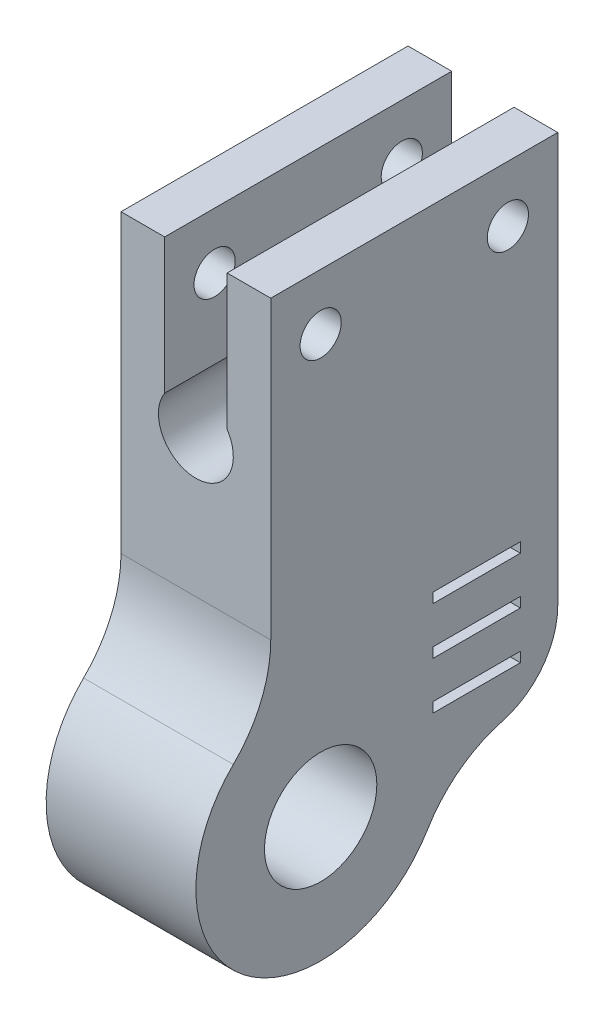
ISO-10303-21;
HEADER;
FILE_DESCRIPTION(('STEP AP214'),'2;1');
FILE_NAME('part.step','',(''),(''),'','','');
FILE_SCHEMA(('AUTOMOTIVE_DESIGN { 1 0 10303 214 1 1 1 1 }'));
ENDSEC;
DATA;
#1=APPLICATION_CONTEXT('core data for automotive mechanical design processes');
#2=APPLICATION_PROTOCOL_DEFINITION('international standard','automotive_design',2000,#1);
#3=PRODUCT_CONTEXT('',#1,'mechanical');
#4=PRODUCT('Part','Part','',(#3));
#5=PRODUCT_RELATED_PRODUCT_CATEGORY('part','',(#4));
#6=PRODUCT_DEFINITION_FORMATION('','',#4);
#7=PRODUCT_DEFINITION_CONTEXT('part definition',#1,'design');
#8=PRODUCT_DEFINITION('design','',#6,#7);
#9=PRODUCT_DEFINITION_SHAPE('','',#8);
#10=(LENGTH_UNIT() NAMED_UNIT(*) SI_UNIT(.MILLI.,.METRE.));
#11=(NAMED_UNIT(*) PLANE_ANGLE_UNIT() SI_UNIT($,.RADIAN.));
#12=(NAMED_UNIT(*) SI_UNIT($,.STERADIAN.) SOLID_ANGLE_UNIT());
#13=UNCERTAINTY_MEASURE_WITH_UNIT(LENGTH_MEASURE(1.E-05),#10,'distance_accuracy_value','');
#14=(GEOMETRIC_REPRESENTATION_CONTEXT(3) GLOBAL_UNCERTAINTY_ASSIGNED_CONTEXT((#13)) GLOBAL_UNIT_ASSIGNED_CONTEXT((#10,
#11,#12)) REPRESENTATION_CONTEXT('',''));
#15=CARTESIAN_POINT('',(0.,0.,0.));
#16=DIRECTION('',(0.,0.,1.));
#17=DIRECTION('',(1.,0.,0.));
#18=AXIS2_PLACEMENT_3D('',#15,#16,#17);
#19=CARTESIAN_POINT('',(0.,0.299999999999998,-4.));
#20=DIRECTION('',(-1.,0.,0.));
#21=DIRECTION('',(0.,0.,1.));
#22=AXIS2_PLACEMENT_3D('',#19,#20,#21);
#23=PLANE('',#22);
#24=CARTESIAN_POINT('',(0.,33.8,-4.));
#25=DIRECTION('',(1.,0.,0.));
#26=DIRECTION('',(0.,0.,-1.));
#27=AXIS2_PLACEMENT_3D('',#24,#25,#26);
#28=CIRCLE('',#27,1.65);
#29=CARTESIAN_POINT('',(0.,33.8,-5.65));
#30=VERTEX_POINT('',#29);
#31=EDGE_CURVE('E297',#30,#30,#28,.T.);
#32=ORIENTED_EDGE('',*,*,#31,.T.);
#33=EDGE_LOOP('',(#32));
#34=FACE_BOUND('',#33,.T.);
#35=DIRECTION('',(0.,0.,1.));
#36=VECTOR('',#35,1.);
#37=CARTESIAN_POINT('',(0.,7.6,-13.));
#38=LINE('',#37,#36);
#39=CARTESIAN_POINT('',(0.,7.6,-20.));
#40=VERTEX_POINT('',#39);
#41=CARTESIAN_POINT('',(0.,7.6,-13.));
#42=VERTEX_POINT('',#41);
#43=EDGE_CURVE('E340',#40,#42,#38,.T.);
#44=ORIENTED_EDGE('',*,*,#43,.T.);
#45=DIRECTION('',(0.,-1.,0.));
#46=VECTOR('',#45,1.);
#47=CARTESIAN_POINT('',(0.,7.6,-13.));
#48=LINE('',#47,#46);
#49=CARTESIAN_POINT('',(0.,6.8,-13.));
#50=VERTEX_POINT('',#49);
#51=EDGE_CURVE('E336',#42,#50,#48,.T.);
#52=ORIENTED_EDGE('',*,*,#51,.T.);
#53=DIRECTION('',(0.,0.,-1.));
#54=VECTOR('',#53,1.);
#55=CARTESIAN_POINT('',(0.,6.8,-13.));
#56=LINE('',#55,#54);
#57=CARTESIAN_POINT('',(0.,6.8,-20.));
#58=VERTEX_POINT('',#57);
#59=EDGE_CURVE('E350',#50,#58,#56,.T.);
#60=ORIENTED_EDGE('',*,*,#59,.T.);
#61=DIRECTION('',(0.,1.,0.));
#62=VECTOR('',#61,1.);
#63=CARTESIAN_POINT('',(0.,7.6,-20.));
#64=LINE('',#63,#62);
#65=EDGE_CURVE('E353',#58,#40,#64,.T.);
#66=ORIENTED_EDGE('',*,*,#65,.T.);
#67=EDGE_LOOP('',(#44,#52,#60,#66));
#68=FACE_BOUND('',#67,.T.);
#69=DIRECTION('',(0.,1.,0.));
#70=VECTOR('',#69,1.);
#71=CARTESIAN_POINT('',(0.,0.,-23.));
#72=LINE('',#71,#70);
#73=CARTESIAN_POINT('',(0.,5.45408982043008,-23.));
#74=VERTEX_POINT('',#73);
#75=CARTESIAN_POINT('',(0.,38.3,-23.));
#76=VERTEX_POINT('',#75);
#77=EDGE_CURVE('E398',#74,#76,#72,.T.);
#78=ORIENTED_EDGE('',*,*,#77,.F.);
#79=CARTESIAN_POINT('',(0.,5.45408982043008,-17.));
#80=DIRECTION('',(-1.,0.,0.));
#81=DIRECTION('',(0.,0.,1.));
#82=AXIS2_PLACEMENT_3D('',#79,#80,#81);
#83=CIRCLE('',#82,6.);
#84=CARTESIAN_POINT('',(0.,-0.341193862231198,-18.5539263294892));
#85=VERTEX_POINT('',#84);
#86=EDGE_CURVE('E55',#74,#85,#83,.T.);
#87=ORIENTED_EDGE('',*,*,#86,.T.);
#88=CARTESIAN_POINT('',(0.,-10.,-21.1438035453046));
#89=DIRECTION('',(-1.,0.,0.));
#90=DIRECTION('',(0.,0.,1.));
#91=AXIS2_PLACEMENT_3D('',#88,#89,#90);
#92=CIRCLE('',#91,10.);
#93=CARTESIAN_POINT('',(0.,-4.85,-12.5719017726523));
#94=VERTEX_POINT('',#93);
#95=EDGE_CURVE('E438',#85,#94,#92,.F.);
#96=ORIENTED_EDGE('',*,*,#95,.T.);
#97=CARTESIAN_POINT('',(0.,0.299999999999998,-4.));
#98=DIRECTION('',(1.,0.,0.));
#99=DIRECTION('',(0.,0.,1.));
#100=AXIS2_PLACEMENT_3D('',#97,#98,#99);
#101=CIRCLE('',#100,10.);
#102=CARTESIAN_POINT('',(0.,7.44142842854285,3.));
#103=VERTEX_POINT('',#102);
#104=EDGE_CURVE('E402',#103,#94,#101,.T.);
#105=ORIENTED_EDGE('',*,*,#104,.F.);
#106=CARTESIAN_POINT('',(0.,14.5828568570857,10.));
#107=DIRECTION('',(-1.,0.,0.));
#108=DIRECTION('',(0.,0.,1.));
#109=AXIS2_PLACEMENT_3D('',#106,#107,#108);
#110=CIRCLE('',#109,10.);
#111=CARTESIAN_POINT('',(0.,14.5828568570857,0.));
#112=VERTEX_POINT('',#111);
#113=EDGE_CURVE('E442',#103,#112,#110,.F.);
#114=ORIENTED_EDGE('',*,*,#113,.T.);
#115=DIRECTION('',(0.,-1.,0.));
#116=VECTOR('',#115,1.);
#117=CARTESIAN_POINT('',(0.,9.46515138991168,0.));
#118=LINE('',#117,#116);
#119=CARTESIAN_POINT('',(0.,38.3,0.));
#120=VERTEX_POINT('',#119);
#121=EDGE_CURVE('E415',#120,#112,#118,.T.);
#122=ORIENTED_EDGE('',*,*,#121,.F.);
#123=DIRECTION('',(0.,0.,1.));
#124=VECTOR('',#123,1.);
#125=CARTESIAN_POINT('',(0.,38.3,0.));
#126=LINE('',#125,#124);
#127=EDGE_CURVE('E412',#76,#120,#126,.T.);
#128=ORIENTED_EDGE('',*,*,#127,.F.);
#129=EDGE_LOOP('',(#78,#87,#96,#105,#114,#122,#128));
#130=FACE_BOUND('',#129,.T.);
#131=DIRECTION('',(0.,0.,1.));
#132=VECTOR('',#131,1.);
#133=CARTESIAN_POINT('',(0.,3.8,-13.));
#134=LINE('',#133,#132);
#135=CARTESIAN_POINT('',(0.,3.8,-20.));
#136=VERTEX_POINT('',#135);
#137=CARTESIAN_POINT('',(0.,3.8,-13.));
#138=VERTEX_POINT('',#137);
#139=EDGE_CURVE('E371',#136,#138,#134,.T.);
#140=ORIENTED_EDGE('',*,*,#139,.T.);
#141=DIRECTION('',(0.,-1.,0.));
#142=VECTOR('',#141,1.);
#143=CARTESIAN_POINT('',(0.,3.8,-13.));
#144=LINE('',#143,#142);
#145=CARTESIAN_POINT('',(0.,3.,-13.));
#146=VERTEX_POINT('',#145);
#147=EDGE_CURVE('E367',#138,#146,#144,.T.);
#148=ORIENTED_EDGE('',*,*,#147,.T.);
#149=DIRECTION('',(0.,0.,-1.));
#150=VECTOR('',#149,1.);
#151=CARTESIAN_POINT('',(0.,3.,-13.));
#152=LINE('',#151,#150);
#153=CARTESIAN_POINT('',(0.,3.,-20.));
#154=VERTEX_POINT('',#153);
#155=EDGE_CURVE('E381',#146,#154,#152,.T.);
#156=ORIENTED_EDGE('',*,*,#155,.T.);
#157=DIRECTION('',(0.,1.,0.));
#158=VECTOR('',#157,1.);
#159=CARTESIAN_POINT('',(0.,3.8,-20.));
#160=LINE('',#159,#158);
#161=EDGE_CURVE('E384',#154,#136,#160,.T.);
#162=ORIENTED_EDGE('',*,*,#161,.T.);
#163=EDGE_LOOP('',(#140,#148,#156,#162));
#164=FACE_BOUND('',#163,.T.);
#165=DIRECTION('',(0.,0.,1.));
#166=VECTOR('',#165,1.);
#167=CARTESIAN_POINT('',(0.,11.4,-13.));
#168=LINE('',#167,#166);
#169=CARTESIAN_POINT('',(0.,11.4,-20.));
#170=VERTEX_POINT('',#169);
#171=CARTESIAN_POINT('',(0.,11.4,-13.));
#172=VERTEX_POINT('',#171);
#173=EDGE_CURVE('E309',#170,#172,#168,.T.);
#174=ORIENTED_EDGE('',*,*,#173,.T.);
#175=DIRECTION('',(0.,-1.,0.));
#176=VECTOR('',#175,1.);
#177=CARTESIAN_POINT('',(0.,10.6,-13.));
#178=LINE('',#177,#176);
#179=CARTESIAN_POINT('',(0.,10.6,-13.));
#180=VERTEX_POINT('',#179);
#181=EDGE_CURVE('E303',#172,#180,#178,.T.);
#182=ORIENTED_EDGE('',*,*,#181,.T.);
#183=DIRECTION('',(0.,0.,-1.));
#184=VECTOR('',#183,1.);
#185=CARTESIAN_POINT('',(0.,10.6,-13.));
#186=LINE('',#185,#184);
#187=CARTESIAN_POINT('',(0.,10.6,-20.));
#188=VERTEX_POINT('',#187);
#189=EDGE_CURVE('E319',#180,#188,#186,.T.);
#190=ORIENTED_EDGE('',*,*,#189,.T.);
#191=DIRECTION('',(0.,1.,0.));
#192=VECTOR('',#191,1.);
#193=CARTESIAN_POINT('',(0.,10.6,-20.));
#194=LINE('',#193,#192);
#195=EDGE_CURVE('E322',#188,#170,#194,.T.);
#196=ORIENTED_EDGE('',*,*,#195,.T.);
#197=EDGE_LOOP('',(#174,#182,#190,#196));
#198=FACE_BOUND('',#197,.T.);
#199=CARTESIAN_POINT('',(0.,33.8,-19.));
#200=DIRECTION('',(1.,0.,0.));
#201=DIRECTION('',(0.,0.,-1.));
#202=AXIS2_PLACEMENT_3D('',#199,#200,#201);
#203=CIRCLE('',#202,1.65);
#204=CARTESIAN_POINT('',(0.,33.8,-20.65));
#205=VERTEX_POINT('',#204);
#206=EDGE_CURVE('E293',#205,#205,#203,.T.);
#207=ORIENTED_EDGE('',*,*,#206,.T.);
#208=EDGE_LOOP('',(#207));
#209=FACE_BOUND('',#208,.T.);
#210=DIRECTION('',(0.,0.866025403784439,0.499999999999999));
#211=VECTOR('',#210,1.);
#212=CARTESIAN_POINT('',(0.,0.299999999999993,-11.7942286340599));
#213=LINE('',#212,#211);
#214=CARTESIAN_POINT('',(0.,0.299999999999993,-11.7942286340599));
#215=VERTEX_POINT('',#214);
#216=CARTESIAN_POINT('',(0.,7.04999999999999,-7.89711431702998));
#217=VERTEX_POINT('',#216);
#218=EDGE_CURVE('E242',#215,#217,#213,.T.);
#219=ORIENTED_EDGE('',*,*,#218,.T.);
#220=DIRECTION('',(0.,0.,1.));
#221=VECTOR('',#220,1.);
#222=CARTESIAN_POINT('',(0.,7.04999999999999,-7.89711431702998));
#223=LINE('',#222,#221);
#224=CARTESIAN_POINT('',(0.,7.04999999999999,-0.102885682970029));
#225=VERTEX_POINT('',#224);
#226=EDGE_CURVE('E652',#217,#225,#223,.T.);
#227=ORIENTED_EDGE('',*,*,#226,.T.);
#228=DIRECTION('',(0.,-0.866025403784439,0.5));
#229=VECTOR('',#228,1.);
#230=CARTESIAN_POINT('',(0.,7.04999999999999,-0.102885682970029));
#231=LINE('',#230,#229);
#232=CARTESIAN_POINT('',(0.,0.3,3.79422863405994));
#233=VERTEX_POINT('',#232);
#234=EDGE_CURVE('E246',#225,#233,#231,.T.);
#235=ORIENTED_EDGE('',*,*,#234,.T.);
#236=DIRECTION('',(0.,-0.866025403784439,-0.5));
#237=VECTOR('',#236,1.);
#238=CARTESIAN_POINT('',(0.,0.3,3.79422863405994));
#239=LINE('',#238,#237);
#240=CARTESIAN_POINT('',(0.,-6.45,-0.102885682970025));
#241=VERTEX_POINT('',#240);
#242=EDGE_CURVE('E671',#233,#241,#239,.T.);
#243=ORIENTED_EDGE('',*,*,#242,.T.);
#244=DIRECTION('',(0.,0.,-1.));
#245=VECTOR('',#244,1.);
#246=CARTESIAN_POINT('',(0.,-6.45,-0.102885682970025));
#247=LINE('',#246,#245);
#248=CARTESIAN_POINT('',(0.,-6.45,-7.89711431702997));
#249=VERTEX_POINT('',#248);
#250=EDGE_CURVE('E658',#241,#249,#247,.T.);
#251=ORIENTED_EDGE('',*,*,#250,.T.);
#252=DIRECTION('',(0.,0.866025403784438,-0.5));
#253=VECTOR('',#252,1.);
#254=CARTESIAN_POINT('',(0.,-6.45,-7.89711431702997));
#255=LINE('',#254,#253);
#256=EDGE_CURVE('E655',#249,#215,#255,.T.);
#257=ORIENTED_EDGE('',*,*,#256,.T.);
#258=EDGE_LOOP('',(#219,#227,#235,#243,#251,#257));
#259=FACE_BOUND('',#258,.T.);
#260=ADVANCED_FACE('F33',(#34,#68,#130,#164,#198,#209,#259),#23,.T.);
#261=CARTESIAN_POINT('',(12.,38.3,0.));
#262=DIRECTION('',(0.,-1.,0.));
#263=DIRECTION('',(0.,0.,-1.));
#264=AXIS2_PLACEMENT_3D('',#261,#262,#263);
#265=PLANE('',#264);
#266=DIRECTION('',(-1.,0.,0.));
#267=VECTOR('',#266,1.);
#268=CARTESIAN_POINT('',(12.,38.3,0.));
#269=LINE('',#268,#267);
#270=CARTESIAN_POINT('',(3.5,38.3,0.));
#271=VERTEX_POINT('',#270);
#272=EDGE_CURVE('E410',#271,#120,#269,.T.);
#273=ORIENTED_EDGE('',*,*,#272,.F.);
#274=DIRECTION('',(0.,0.,1.));
#275=VECTOR('',#274,1.);
#276=CARTESIAN_POINT('',(3.5,38.3,-23.));
#277=LINE('',#276,#275);
#278=CARTESIAN_POINT('',(3.5,38.3,-23.));
#279=VERTEX_POINT('',#278);
#280=EDGE_CURVE('E273',#279,#271,#277,.T.);
#281=ORIENTED_EDGE('',*,*,#280,.F.);
#282=DIRECTION('',(-1.,0.,0.));
#283=VECTOR('',#282,1.);
#284=CARTESIAN_POINT('',(12.,38.3,-23.));
#285=LINE('',#284,#283);
#286=EDGE_CURVE('E423',#279,#76,#285,.T.);
#287=ORIENTED_EDGE('',*,*,#286,.T.);
#288=ORIENTED_EDGE('',*,*,#127,.T.);
#289=EDGE_LOOP('',(#273,#281,#287,#288));
#290=FACE_BOUND('',#289,.T.);
#291=ADVANCED_FACE('F463',(#290),#265,.F.);
#292=CARTESIAN_POINT('',(12.,33.8,-4.));
#293=DIRECTION('',(-1.,0.,0.));
#294=DIRECTION('',(0.,0.,1.));
#295=AXIS2_PLACEMENT_3D('',#292,#293,#294);
#296=CYLINDRICAL_SURFACE('',#295,1.65);
#297=CARTESIAN_POINT('',(3.5,33.8,-4.));
#298=DIRECTION('',(-1.,0.,0.));
#299=DIRECTION('',(0.,-1.,0.));
#300=AXIS2_PLACEMENT_3D('',#297,#298,#299);
#301=CIRCLE('',#300,1.65);
#302=CARTESIAN_POINT('',(3.5,32.15,-4.));
#303=VERTEX_POINT('',#302);
#304=EDGE_CURVE('E287',#303,#303,#301,.T.);
#305=ORIENTED_EDGE('',*,*,#304,.F.);
#306=EDGE_LOOP('',(#305));
#307=FACE_BOUND('',#306,.T.);
#308=ORIENTED_EDGE('',*,*,#31,.F.);
#309=EDGE_LOOP('',(#308));
#310=FACE_BOUND('',#309,.T.);
#311=ADVANCED_FACE('F498',(#307,#310),#296,.F.);
#312=CARTESIAN_POINT('',(12.,33.8,-19.));
#313=DIRECTION('',(-1.,0.,0.));
#314=DIRECTION('',(0.,0.,1.));
#315=AXIS2_PLACEMENT_3D('',#312,#313,#314);
#316=CYLINDRICAL_SURFACE('',#315,1.65);
#317=CARTESIAN_POINT('',(3.5,33.8,-19.));
#318=DIRECTION('',(-1.,0.,0.));
#319=DIRECTION('',(0.,-1.,0.));
#320=AXIS2_PLACEMENT_3D('',#317,#318,#319);
#321=CIRCLE('',#320,1.65);
#322=CARTESIAN_POINT('',(3.5,32.15,-19.));
#323=VERTEX_POINT('',#322);
#324=EDGE_CURVE('E286',#323,#323,#321,.T.);
#325=ORIENTED_EDGE('',*,*,#324,.F.);
#326=EDGE_LOOP('',(#325));
#327=FACE_BOUND('',#326,.T.);
#328=ORIENTED_EDGE('',*,*,#206,.F.);
#329=EDGE_LOOP('',(#328));
#330=FACE_BOUND('',#329,.T.);
#331=ADVANCED_FACE('F567',(#327,#330),#316,.F.);
#332=CARTESIAN_POINT('',(12.,0.299999999999998,-4.));
#333=DIRECTION('',(-1.,0.,0.));
#334=DIRECTION('',(0.,0.,1.));
#335=AXIS2_PLACEMENT_3D('',#332,#333,#334);
#336=PLANE('',#335);
#337=CARTESIAN_POINT('',(12.,33.8,-19.));
#338=DIRECTION('',(1.,0.,0.));
#339=DIRECTION('',(0.,0.,-1.));
#340=AXIS2_PLACEMENT_3D('',#337,#338,#339);
#341=CIRCLE('',#340,1.65);
#342=CARTESIAN_POINT('',(12.,33.8,-20.65));
#343=VERTEX_POINT('',#342);
#344=EDGE_CURVE('E294',#343,#343,#341,.T.);
#345=ORIENTED_EDGE('',*,*,#344,.F.);
#346=EDGE_LOOP('',(#345));
#347=FACE_BOUND('',#346,.T.);
#348=DIRECTION('',(0.,-1.,0.));
#349=VECTOR('',#348,1.);
#350=CARTESIAN_POINT('',(12.,10.6,-13.));
#351=LINE('',#350,#349);
#352=CARTESIAN_POINT('',(12.,11.4,-13.));
#353=VERTEX_POINT('',#352);
#354=CARTESIAN_POINT('',(12.,10.6,-13.));
#355=VERTEX_POINT('',#354);
#356=EDGE_CURVE('E306',#353,#355,#351,.T.);
#357=ORIENTED_EDGE('',*,*,#356,.F.);
#358=DIRECTION('',(0.,0.,1.));
#359=VECTOR('',#358,1.);
#360=CARTESIAN_POINT('',(12.,11.4,-13.));
#361=LINE('',#360,#359);
#362=CARTESIAN_POINT('',(12.,11.4,-20.));
#363=VERTEX_POINT('',#362);
#364=EDGE_CURVE('E314',#363,#353,#361,.T.);
#365=ORIENTED_EDGE('',*,*,#364,.F.);
#366=DIRECTION('',(0.,1.,0.));
#367=VECTOR('',#366,1.);
#368=CARTESIAN_POINT('',(12.,10.6,-20.));
#369=LINE('',#368,#367);
#370=CARTESIAN_POINT('',(12.,10.6,-20.));
#371=VERTEX_POINT('',#370);
#372=EDGE_CURVE('E311',#371,#363,#369,.T.);
#373=ORIENTED_EDGE('',*,*,#372,.F.);
#374=DIRECTION('',(0.,0.,-1.));
#375=VECTOR('',#374,1.);
#376=CARTESIAN_POINT('',(12.,10.6,-13.));
#377=LINE('',#376,#375);
#378=EDGE_CURVE('E308',#355,#371,#377,.T.);
#379=ORIENTED_EDGE('',*,*,#378,.F.);
#380=EDGE_LOOP('',(#357,#365,#373,#379));
#381=FACE_BOUND('',#380,.T.);
#382=DIRECTION('',(0.,-1.,0.));
#383=VECTOR('',#382,1.);
#384=CARTESIAN_POINT('',(12.,3.8,-13.));
#385=LINE('',#384,#383);
#386=CARTESIAN_POINT('',(12.,3.8,-13.));
#387=VERTEX_POINT('',#386);
#388=CARTESIAN_POINT('',(12.,3.,-13.));
#389=VERTEX_POINT('',#388);
#390=EDGE_CURVE('E368',#387,#389,#385,.T.);
#391=ORIENTED_EDGE('',*,*,#390,.F.);
#392=DIRECTION('',(0.,0.,1.));
#393=VECTOR('',#392,1.);
#394=CARTESIAN_POINT('',(12.,3.8,-13.));
#395=LINE('',#394,#393);
#396=CARTESIAN_POINT('',(12.,3.8,-20.));
#397=VERTEX_POINT('',#396);
#398=EDGE_CURVE('E376',#397,#387,#395,.T.);
#399=ORIENTED_EDGE('',*,*,#398,.F.);
#400=DIRECTION('',(0.,1.,0.));
#401=VECTOR('',#400,1.);
#402=CARTESIAN_POINT('',(12.,3.8,-20.));
#403=LINE('',#402,#401);
#404=CARTESIAN_POINT('',(12.,3.,-20.));
#405=VERTEX_POINT('',#404);
#406=EDGE_CURVE('E373',#405,#397,#403,.T.);
#407=ORIENTED_EDGE('',*,*,#406,.F.);
#408=DIRECTION('',(0.,0.,-1.));
#409=VECTOR('',#408,1.);
#410=CARTESIAN_POINT('',(12.,3.,-13.));
#411=LINE('',#410,#409);
#412=EDGE_CURVE('E370',#389,#405,#411,.T.);
#413=ORIENTED_EDGE('',*,*,#412,.F.);
#414=EDGE_LOOP('',(#391,#399,#407,#413));
#415=FACE_BOUND('',#414,.T.);
#416=CARTESIAN_POINT('',(12.,-10.,-21.1438035453046));
#417=DIRECTION('',(-1.,0.,0.));
#418=DIRECTION('',(0.,0.,1.));
#419=AXIS2_PLACEMENT_3D('',#416,#417,#418);
#420=CIRCLE('',#419,10.);
#421=CARTESIAN_POINT('',(12.,-4.85,-12.5719017726523));
#422=VERTEX_POINT('',#421);
#423=CARTESIAN_POINT('',(12.,-0.341193862231198,-18.5539263294892));
#424=VERTEX_POINT('',#423);
#425=EDGE_CURVE('E440',#422,#424,#420,.T.);
#426=ORIENTED_EDGE('',*,*,#425,.T.);
#427=CARTESIAN_POINT('',(12.,5.45408982043008,-17.));
#428=DIRECTION('',(-1.,0.,0.));
#429=DIRECTION('',(0.,0.,1.));
#430=AXIS2_PLACEMENT_3D('',#427,#428,#429);
#431=CIRCLE('',#430,6.);
#432=CARTESIAN_POINT('',(12.,5.45408982043008,-23.));
#433=VERTEX_POINT('',#432);
#434=EDGE_CURVE('E11',#424,#433,#431,.F.);
#435=ORIENTED_EDGE('',*,*,#434,.T.);
#436=DIRECTION('',(0.,1.,0.));
#437=VECTOR('',#436,1.);
#438=CARTESIAN_POINT('',(12.,0.,-23.));
#439=LINE('',#438,#437);
#440=CARTESIAN_POINT('',(12.,38.3,-23.));
#441=VERTEX_POINT('',#440);
#442=EDGE_CURVE('E399',#433,#441,#439,.T.);
#443=ORIENTED_EDGE('',*,*,#442,.T.);
#444=DIRECTION('',(0.,0.,1.));
#445=VECTOR('',#444,1.);
#446=CARTESIAN_POINT('',(12.,38.3,0.));
#447=LINE('',#446,#445);
#448=CARTESIAN_POINT('',(12.,38.3,0.));
#449=VERTEX_POINT('',#448);
#450=EDGE_CURVE('E401',#441,#449,#447,.T.);
#451=ORIENTED_EDGE('',*,*,#450,.T.);
#452=DIRECTION('',(0.,-1.,0.));
#453=VECTOR('',#452,1.);
#454=CARTESIAN_POINT('',(12.,9.46515138991168,0.));
#455=LINE('',#454,#453);
#456=CARTESIAN_POINT('',(12.,14.5828568570857,0.));
#457=VERTEX_POINT('',#456);
#458=EDGE_CURVE('E404',#449,#457,#455,.T.);
#459=ORIENTED_EDGE('',*,*,#458,.T.);
#460=CARTESIAN_POINT('',(12.,14.5828568570857,10.));
#461=DIRECTION('',(-1.,0.,0.));
#462=DIRECTION('',(0.,0.,1.));
#463=AXIS2_PLACEMENT_3D('',#460,#461,#462);
#464=CIRCLE('',#463,10.);
#465=CARTESIAN_POINT('',(12.,7.44142842854285,3.));
#466=VERTEX_POINT('',#465);
#467=EDGE_CURVE('E444',#457,#466,#464,.T.);
#468=ORIENTED_EDGE('',*,*,#467,.T.);
#469=CARTESIAN_POINT('',(12.,0.299999999999998,-4.));
#470=DIRECTION('',(1.,0.,0.));
#471=DIRECTION('',(0.,0.,1.));
#472=AXIS2_PLACEMENT_3D('',#469,#470,#471);
#473=CIRCLE('',#472,10.);
#474=EDGE_CURVE('E407',#466,#422,#473,.T.);
#475=ORIENTED_EDGE('',*,*,#474,.T.);
#476=EDGE_LOOP('',(#426,#435,#443,#451,#459,#468,#475));
#477=FACE_BOUND('',#476,.T.);
#478=DIRECTION('',(0.,-1.,0.));
#479=VECTOR('',#478,1.);
#480=CARTESIAN_POINT('',(12.,7.6,-13.));
#481=LINE('',#480,#479);
#482=CARTESIAN_POINT('',(12.,7.6,-13.));
#483=VERTEX_POINT('',#482);
#484=CARTESIAN_POINT('',(12.,6.8,-13.));
#485=VERTEX_POINT('',#484);
#486=EDGE_CURVE('E337',#483,#485,#481,.T.);
#487=ORIENTED_EDGE('',*,*,#486,.F.);
#488=DIRECTION('',(0.,0.,1.));
#489=VECTOR('',#488,1.);
#490=CARTESIAN_POINT('',(12.,7.6,-13.));
#491=LINE('',#490,#489);
#492=CARTESIAN_POINT('',(12.,7.6,-20.));
#493=VERTEX_POINT('',#492);
#494=EDGE_CURVE('E345',#493,#483,#491,.T.);
#495=ORIENTED_EDGE('',*,*,#494,.F.);
#496=DIRECTION('',(0.,1.,0.));
#497=VECTOR('',#496,1.);
#498=CARTESIAN_POINT('',(12.,7.6,-20.));
#499=LINE('',#498,#497);
#500=CARTESIAN_POINT('',(12.,6.8,-20.));
#501=VERTEX_POINT('',#500);
#502=EDGE_CURVE('E342',#501,#493,#499,.T.);
#503=ORIENTED_EDGE('',*,*,#502,.F.);
#504=DIRECTION('',(0.,0.,-1.));
#505=VECTOR('',#504,1.);
#506=CARTESIAN_POINT('',(12.,6.8,-13.));
#507=LINE('',#506,#505);
#508=EDGE_CURVE('E339',#485,#501,#507,.T.);
#509=ORIENTED_EDGE('',*,*,#508,.F.);
#510=EDGE_LOOP('',(#487,#495,#503,#509));
#511=FACE_BOUND('',#510,.T.);
#512=CARTESIAN_POINT('',(12.,33.8,-4.));
#513=DIRECTION('',(1.,0.,0.));
#514=DIRECTION('',(0.,0.,-1.));
#515=AXIS2_PLACEMENT_3D('',#512,#513,#514);
#516=CIRCLE('',#515,1.65);
#517=CARTESIAN_POINT('',(12.,33.8,-5.65));
#518=VERTEX_POINT('',#517);
#519=EDGE_CURVE('E300',#518,#518,#516,.T.);
#520=ORIENTED_EDGE('',*,*,#519,.F.);
#521=EDGE_LOOP('',(#520));
#522=FACE_BOUND('',#521,.T.);
#523=CARTESIAN_POINT('',(12.,0.299999999999998,-4.));
#524=DIRECTION('',(1.,0.,0.));
#525=DIRECTION('',(0.,0.,-1.));
#526=AXIS2_PLACEMENT_3D('',#523,#524,#525);
#527=CIRCLE('',#526,4.5);
#528=CARTESIAN_POINT('',(12.,0.299999999999998,-8.5));
#529=VERTEX_POINT('',#528);
#530=EDGE_CURVE('E290',#529,#529,#527,.T.);
#531=ORIENTED_EDGE('',*,*,#530,.F.);
#532=EDGE_LOOP('',(#531));
#533=FACE_BOUND('',#532,.T.);
#534=ADVANCED_FACE('F482',(#347,#381,#415,#477,#511,#522,#533),#336,.F.);
#535=CARTESIAN_POINT('',(12.,0.,-23.));
#536=DIRECTION('',(0.,0.,1.));
#537=DIRECTION('',(1.,0.,0.));
#538=AXIS2_PLACEMENT_3D('',#535,#536,#537);
#539=PLANE('',#538);
#540=ORIENTED_EDGE('',*,*,#442,.F.);
#541=DIRECTION('',(-1.,0.,0.));
#542=VECTOR('',#541,1.);
#543=CARTESIAN_POINT('',(12.,5.45408982043008,-23.));
#544=LINE('',#543,#542);
#545=EDGE_CURVE('E446',#433,#74,#544,.T.);
#546=ORIENTED_EDGE('',*,*,#545,.T.);
#547=ORIENTED_EDGE('',*,*,#77,.T.);
#548=ORIENTED_EDGE('',*,*,#286,.F.);
#549=DIRECTION('',(0.,-1.,0.));
#550=VECTOR('',#549,1.);
#551=CARTESIAN_POINT('',(3.5,38.3,-23.));
#552=LINE('',#551,#550);
#553=CARTESIAN_POINT('',(3.5,27.4583123951777,-23.));
#554=VERTEX_POINT('',#553);
#555=EDGE_CURVE('E257',#279,#554,#552,.T.);
#556=ORIENTED_EDGE('',*,*,#555,.T.);
#557=CARTESIAN_POINT('',(6.,25.8,-23.));
#558=DIRECTION('',(0.,0.,1.));
#559=DIRECTION('',(1.,0.,0.));
#560=AXIS2_PLACEMENT_3D('',#557,#558,#559);
#561=CIRCLE('',#560,3.);
#562=CARTESIAN_POINT('',(8.5,27.4583123951777,-23.));
#563=VERTEX_POINT('',#562);
#564=EDGE_CURVE('E260',#554,#563,#561,.T.);
#565=ORIENTED_EDGE('',*,*,#564,.T.);
#566=DIRECTION('',(0.,1.,0.));
#567=VECTOR('',#566,1.);
#568=CARTESIAN_POINT('',(8.5,38.3,-23.));
#569=LINE('',#568,#567);
#570=CARTESIAN_POINT('',(8.5,38.3,-23.));
#571=VERTEX_POINT('',#570);
#572=EDGE_CURVE('E264',#563,#571,#569,.T.);
#573=ORIENTED_EDGE('',*,*,#572,.T.);
#574=EDGE_CURVE('E424',#441,#571,#285,.T.);
#575=ORIENTED_EDGE('',*,*,#574,.F.);
#576=EDGE_LOOP('',(#540,#546,#547,#548,#556,#565,#573,#575));
#577=FACE_BOUND('',#576,.T.);
#578=ADVANCED_FACE('F452',(#577),#539,.F.);
#579=ORIENTED_EDGE('',*,*,#574,.T.);
#580=DIRECTION('',(0.,0.,1.));
#581=VECTOR('',#580,1.);
#582=CARTESIAN_POINT('',(8.5,38.3,-23.));
#583=LINE('',#582,#581);
#584=CARTESIAN_POINT('',(8.5,38.3,0.));
#585=VERTEX_POINT('',#584);
#586=EDGE_CURVE('E276',#571,#585,#583,.T.);
#587=ORIENTED_EDGE('',*,*,#586,.T.);
#588=EDGE_CURVE('E420',#449,#585,#269,.T.);
#589=ORIENTED_EDGE('',*,*,#588,.F.);
#590=ORIENTED_EDGE('',*,*,#450,.F.);
#591=EDGE_LOOP('',(#579,#587,#589,#590));
#592=FACE_BOUND('',#591,.T.);
#593=ADVANCED_FACE('F478',(#592),#265,.F.);
#594=CARTESIAN_POINT('',(12.,9.46515138991168,0.));
#595=DIRECTION('',(0.,0.,-1.));
#596=DIRECTION('',(-1.,0.,0.));
#597=AXIS2_PLACEMENT_3D('',#594,#595,#596);
#598=PLANE('',#597);
#599=ORIENTED_EDGE('',*,*,#121,.T.);
#600=DIRECTION('',(1.,0.,0.));
#601=VECTOR('',#600,1.);
#602=CARTESIAN_POINT('',(12.,14.5828568570857,0.));
#603=LINE('',#602,#601);
#604=EDGE_CURVE('E436',#112,#457,#603,.T.);
#605=ORIENTED_EDGE('',*,*,#604,.T.);
#606=ORIENTED_EDGE('',*,*,#458,.F.);
#607=ORIENTED_EDGE('',*,*,#588,.T.);
#608=DIRECTION('',(0.,1.,0.));
#609=VECTOR('',#608,1.);
#610=CARTESIAN_POINT('',(8.5,38.3,0.));
#611=LINE('',#610,#609);
#612=CARTESIAN_POINT('',(8.5,27.4583123951777,0.));
#613=VERTEX_POINT('',#612);
#614=EDGE_CURVE('E261',#613,#585,#611,.T.);
#615=ORIENTED_EDGE('',*,*,#614,.F.);
#616=CARTESIAN_POINT('',(6.,25.8,0.));
#617=DIRECTION('',(0.,0.,1.));
#618=DIRECTION('',(1.,0.,0.));
#619=AXIS2_PLACEMENT_3D('',#616,#617,#618);
#620=CIRCLE('',#619,3.);
#621=CARTESIAN_POINT('',(3.5,27.4583123951777,0.));
#622=VERTEX_POINT('',#621);
#623=EDGE_CURVE('E269',#622,#613,#620,.T.);
#624=ORIENTED_EDGE('',*,*,#623,.F.);
#625=DIRECTION('',(0.,-1.,0.));
#626=VECTOR('',#625,1.);
#627=CARTESIAN_POINT('',(3.5,38.3,0.));
#628=LINE('',#627,#626);
#629=EDGE_CURVE('E251',#271,#622,#628,.T.);
#630=ORIENTED_EDGE('',*,*,#629,.F.);
#631=ORIENTED_EDGE('',*,*,#272,.T.);
#632=EDGE_LOOP('',(#599,#605,#606,#607,#615,#624,#630,#631));
#633=FACE_BOUND('',#632,.T.);
#634=ADVANCED_FACE('F508',(#633),#598,.F.);
#635=CARTESIAN_POINT('',(12.,0.299999999999998,-4.));
#636=DIRECTION('',(-1.,0.,0.));
#637=DIRECTION('',(0.,0.,1.));
#638=AXIS2_PLACEMENT_3D('',#635,#636,#637);
#639=CYLINDRICAL_SURFACE('',#638,10.);
#640=ORIENTED_EDGE('',*,*,#104,.T.);
#641=DIRECTION('',(-1.,0.,0.));
#642=VECTOR('',#641,1.);
#643=CARTESIAN_POINT('',(12.,-4.85,-12.5719017726523));
#644=LINE('',#643,#642);
#645=EDGE_CURVE('E434',#94,#422,#644,.F.);
#646=ORIENTED_EDGE('',*,*,#645,.T.);
#647=ORIENTED_EDGE('',*,*,#474,.F.);
#648=DIRECTION('',(-1.,0.,0.));
#649=VECTOR('',#648,1.);
#650=CARTESIAN_POINT('',(12.,7.44142842854285,3.));
#651=LINE('',#650,#649);
#652=EDGE_CURVE('E427',#466,#103,#651,.T.);
#653=ORIENTED_EDGE('',*,*,#652,.T.);
#654=EDGE_LOOP('',(#640,#646,#647,#653));
#655=FACE_BOUND('',#654,.T.);
#656=ADVANCED_FACE('F504',(#655),#639,.T.);
#657=CARTESIAN_POINT('',(12.,3.8,-13.));
#658=DIRECTION('',(0.,0.,-1.));
#659=DIRECTION('',(-1.,0.,0.));
#660=AXIS2_PLACEMENT_3D('',#657,#658,#659);
#661=PLANE('',#660);
#662=ORIENTED_EDGE('',*,*,#147,.F.);
#663=DIRECTION('',(-1.,0.,0.));
#664=VECTOR('',#663,1.);
#665=CARTESIAN_POINT('',(12.,3.8,-13.));
#666=LINE('',#665,#664);
#667=EDGE_CURVE('E378',#387,#138,#666,.T.);
#668=ORIENTED_EDGE('',*,*,#667,.F.);
#669=ORIENTED_EDGE('',*,*,#390,.T.);
#670=DIRECTION('',(-1.,0.,0.));
#671=VECTOR('',#670,1.);
#672=CARTESIAN_POINT('',(12.,3.,-13.));
#673=LINE('',#672,#671);
#674=EDGE_CURVE('E395',#389,#146,#673,.T.);
#675=ORIENTED_EDGE('',*,*,#674,.T.);
#676=EDGE_LOOP('',(#662,#668,#669,#675));
#677=FACE_BOUND('',#676,.T.);
#678=ADVANCED_FACE('F507',(#677),#661,.T.);
#679=CARTESIAN_POINT('',(12.,3.,-13.));
#680=DIRECTION('',(0.,1.,0.));
#681=DIRECTION('',(0.,0.,1.));
#682=AXIS2_PLACEMENT_3D('',#679,#680,#681);
#683=PLANE('',#682);
#684=ORIENTED_EDGE('',*,*,#155,.F.);
#685=ORIENTED_EDGE('',*,*,#674,.F.);
#686=ORIENTED_EDGE('',*,*,#412,.T.);
#687=DIRECTION('',(-1.,0.,0.));
#688=VECTOR('',#687,1.);
#689=CARTESIAN_POINT('',(12.,3.,-20.));
#690=LINE('',#689,#688);
#691=EDGE_CURVE('E393',#405,#154,#690,.T.);
#692=ORIENTED_EDGE('',*,*,#691,.T.);
#693=EDGE_LOOP('',(#684,#685,#686,#692));
#694=FACE_BOUND('',#693,.T.);
#695=ADVANCED_FACE('F610',(#694),#683,.T.);
#696=CARTESIAN_POINT('',(12.,3.8,-20.));
#697=DIRECTION('',(0.,0.,1.));
#698=DIRECTION('',(1.,0.,0.));
#699=AXIS2_PLACEMENT_3D('',#696,#697,#698);
#700=PLANE('',#699);
#701=ORIENTED_EDGE('',*,*,#161,.F.);
#702=ORIENTED_EDGE('',*,*,#691,.F.);
#703=ORIENTED_EDGE('',*,*,#406,.T.);
#704=DIRECTION('',(-1.,0.,0.));
#705=VECTOR('',#704,1.);
#706=CARTESIAN_POINT('',(12.,3.8,-20.));
#707=LINE('',#706,#705);
#708=EDGE_CURVE('E391',#397,#136,#707,.T.);
#709=ORIENTED_EDGE('',*,*,#708,.T.);
#710=EDGE_LOOP('',(#701,#702,#703,#709));
#711=FACE_BOUND('',#710,.T.);
#712=ADVANCED_FACE('F606',(#711),#700,.T.);
#713=CARTESIAN_POINT('',(12.,3.8,-13.));
#714=DIRECTION('',(0.,-1.,0.));
#715=DIRECTION('',(0.,0.,-1.));
#716=AXIS2_PLACEMENT_3D('',#713,#714,#715);
#717=PLANE('',#716);
#718=ORIENTED_EDGE('',*,*,#139,.F.);
#719=ORIENTED_EDGE('',*,*,#708,.F.);
#720=ORIENTED_EDGE('',*,*,#398,.T.);
#721=ORIENTED_EDGE('',*,*,#667,.T.);
#722=EDGE_LOOP('',(#718,#719,#720,#721));
#723=FACE_BOUND('',#722,.T.);
#724=ADVANCED_FACE('F602',(#723),#717,.T.);
#725=CARTESIAN_POINT('',(12.,7.6,-13.));
#726=DIRECTION('',(0.,0.,-1.));
#727=DIRECTION('',(-1.,0.,0.));
#728=AXIS2_PLACEMENT_3D('',#725,#726,#727);
#729=PLANE('',#728);
#730=ORIENTED_EDGE('',*,*,#51,.F.);
#731=DIRECTION('',(-1.,0.,0.));
#732=VECTOR('',#731,1.);
#733=CARTESIAN_POINT('',(12.,7.6,-13.));
#734=LINE('',#733,#732);
#735=EDGE_CURVE('E347',#483,#42,#734,.T.);
#736=ORIENTED_EDGE('',*,*,#735,.F.);
#737=ORIENTED_EDGE('',*,*,#486,.T.);
#738=DIRECTION('',(-1.,0.,0.));
#739=VECTOR('',#738,1.);
#740=CARTESIAN_POINT('',(12.,6.8,-13.));
#741=LINE('',#740,#739);
#742=EDGE_CURVE('E364',#485,#50,#741,.T.);
#743=ORIENTED_EDGE('',*,*,#742,.T.);
#744=EDGE_LOOP('',(#730,#736,#737,#743));
#745=FACE_BOUND('',#744,.T.);
#746=ADVANCED_FACE('F598',(#745),#729,.T.);
#747=CARTESIAN_POINT('',(12.,6.8,-13.));
#748=DIRECTION('',(0.,1.,0.));
#749=DIRECTION('',(0.,0.,1.));
#750=AXIS2_PLACEMENT_3D('',#747,#748,#749);
#751=PLANE('',#750);
#752=ORIENTED_EDGE('',*,*,#59,.F.);
#753=ORIENTED_EDGE('',*,*,#742,.F.);
#754=ORIENTED_EDGE('',*,*,#508,.T.);
#755=DIRECTION('',(-1.,0.,0.));
#756=VECTOR('',#755,1.);
#757=CARTESIAN_POINT('',(12.,6.8,-20.));
#758=LINE('',#757,#756);
#759=EDGE_CURVE('E362',#501,#58,#758,.T.);
#760=ORIENTED_EDGE('',*,*,#759,.T.);
#761=EDGE_LOOP('',(#752,#753,#754,#760));
#762=FACE_BOUND('',#761,.T.);
#763=ADVANCED_FACE('F594',(#762),#751,.T.);
#764=CARTESIAN_POINT('',(12.,7.6,-20.));
#765=DIRECTION('',(0.,0.,1.));
#766=DIRECTION('',(0.,-1.,0.));
#767=AXIS2_PLACEMENT_3D('',#764,#765,#766);
#768=PLANE('',#767);
#769=ORIENTED_EDGE('',*,*,#65,.F.);
#770=ORIENTED_EDGE('',*,*,#759,.F.);
#771=ORIENTED_EDGE('',*,*,#502,.T.);
#772=DIRECTION('',(-1.,0.,0.));
#773=VECTOR('',#772,1.);
#774=CARTESIAN_POINT('',(12.,7.6,-20.));
#775=LINE('',#774,#773);
#776=EDGE_CURVE('E360',#493,#40,#775,.T.);
#777=ORIENTED_EDGE('',*,*,#776,.T.);
#778=EDGE_LOOP('',(#769,#770,#771,#777));
#779=FACE_BOUND('',#778,.T.);
#780=ADVANCED_FACE('F590',(#779),#768,.T.);
#781=CARTESIAN_POINT('',(12.,7.6,-13.));
#782=DIRECTION('',(0.,-1.,0.));
#783=DIRECTION('',(0.,0.,-1.));
#784=AXIS2_PLACEMENT_3D('',#781,#782,#783);
#785=PLANE('',#784);
#786=ORIENTED_EDGE('',*,*,#43,.F.);
#787=ORIENTED_EDGE('',*,*,#776,.F.);
#788=ORIENTED_EDGE('',*,*,#494,.T.);
#789=ORIENTED_EDGE('',*,*,#735,.T.);
#790=EDGE_LOOP('',(#786,#787,#788,#789));
#791=FACE_BOUND('',#790,.T.);
#792=ADVANCED_FACE('F586',(#791),#785,.T.);
#793=CARTESIAN_POINT('',(12.,10.6,-13.));
#794=DIRECTION('',(0.,0.,-1.));
#795=DIRECTION('',(-1.,0.,0.));
#796=AXIS2_PLACEMENT_3D('',#793,#794,#795);
#797=PLANE('',#796);
#798=ORIENTED_EDGE('',*,*,#181,.F.);
#799=DIRECTION('',(-1.,0.,0.));
#800=VECTOR('',#799,1.);
#801=CARTESIAN_POINT('',(12.,11.4,-13.));
#802=LINE('',#801,#800);
#803=EDGE_CURVE('E316',#353,#172,#802,.T.);
#804=ORIENTED_EDGE('',*,*,#803,.F.);
#805=ORIENTED_EDGE('',*,*,#356,.T.);
#806=DIRECTION('',(-1.,0.,0.));
#807=VECTOR('',#806,1.);
#808=CARTESIAN_POINT('',(12.,10.6,-13.));
#809=LINE('',#808,#807);
#810=EDGE_CURVE('E333',#355,#180,#809,.T.);
#811=ORIENTED_EDGE('',*,*,#810,.T.);
#812=EDGE_LOOP('',(#798,#804,#805,#811));
#813=FACE_BOUND('',#812,.T.);
#814=ADVANCED_FACE('F582',(#813),#797,.T.);
#815=CARTESIAN_POINT('',(12.,10.6,-13.));
#816=DIRECTION('',(0.,1.,0.));
#817=DIRECTION('',(0.,0.,1.));
#818=AXIS2_PLACEMENT_3D('',#815,#816,#817);
#819=PLANE('',#818);
#820=ORIENTED_EDGE('',*,*,#189,.F.);
#821=ORIENTED_EDGE('',*,*,#810,.F.);
#822=ORIENTED_EDGE('',*,*,#378,.T.);
#823=DIRECTION('',(-1.,0.,0.));
#824=VECTOR('',#823,1.);
#825=CARTESIAN_POINT('',(12.,10.6,-20.));
#826=LINE('',#825,#824);
#827=EDGE_CURVE('E331',#371,#188,#826,.T.);
#828=ORIENTED_EDGE('',*,*,#827,.T.);
#829=EDGE_LOOP('',(#820,#821,#822,#828));
#830=FACE_BOUND('',#829,.T.);
#831=ADVANCED_FACE('F578',(#830),#819,.T.);
#832=CARTESIAN_POINT('',(12.,10.6,-20.));
#833=DIRECTION('',(0.,0.,1.));
#834=DIRECTION('',(0.,-1.,0.));
#835=AXIS2_PLACEMENT_3D('',#832,#833,#834);
#836=PLANE('',#835);
#837=ORIENTED_EDGE('',*,*,#195,.F.);
#838=ORIENTED_EDGE('',*,*,#827,.F.);
#839=ORIENTED_EDGE('',*,*,#372,.T.);
#840=DIRECTION('',(-1.,0.,0.));
#841=VECTOR('',#840,1.);
#842=CARTESIAN_POINT('',(12.,11.4,-20.));
#843=LINE('',#842,#841);
#844=EDGE_CURVE('E329',#363,#170,#843,.T.);
#845=ORIENTED_EDGE('',*,*,#844,.T.);
#846=EDGE_LOOP('',(#837,#838,#839,#845));
#847=FACE_BOUND('',#846,.T.);
#848=ADVANCED_FACE('F574',(#847),#836,.T.);
#849=CARTESIAN_POINT('',(12.,11.4,-13.));
#850=DIRECTION('',(0.,-1.,0.));
#851=DIRECTION('',(0.,0.,-1.));
#852=AXIS2_PLACEMENT_3D('',#849,#850,#851);
#853=PLANE('',#852);
#854=ORIENTED_EDGE('',*,*,#173,.F.);
#855=ORIENTED_EDGE('',*,*,#844,.F.);
#856=ORIENTED_EDGE('',*,*,#364,.T.);
#857=ORIENTED_EDGE('',*,*,#803,.T.);
#858=EDGE_LOOP('',(#854,#855,#856,#857));
#859=FACE_BOUND('',#858,.T.);
#860=ADVANCED_FACE('F570',(#859),#853,.T.);
#861=CARTESIAN_POINT('',(8.5,33.8,-4.));
#862=DIRECTION('',(1.,0.,0.));
#863=DIRECTION('',(0.,1.,0.));
#864=AXIS2_PLACEMENT_3D('',#861,#862,#863);
#865=CIRCLE('',#864,1.65);
#866=CARTESIAN_POINT('',(8.5,35.45,-4.));
#867=VERTEX_POINT('',#866);
#868=EDGE_CURVE('E283',#867,#867,#865,.T.);
#869=ORIENTED_EDGE('',*,*,#868,.F.);
#870=EDGE_LOOP('',(#869));
#871=FACE_BOUND('',#870,.T.);
#872=ORIENTED_EDGE('',*,*,#519,.T.);
#873=EDGE_LOOP('',(#872));
#874=FACE_BOUND('',#873,.T.);
#875=ADVANCED_FACE('F565',(#871,#874),#296,.F.);
#876=CARTESIAN_POINT('',(8.5,33.8,-19.));
#877=DIRECTION('',(1.,0.,0.));
#878=DIRECTION('',(0.,1.,0.));
#879=AXIS2_PLACEMENT_3D('',#876,#877,#878);
#880=CIRCLE('',#879,1.65);
#881=CARTESIAN_POINT('',(8.5,35.45,-19.));
#882=VERTEX_POINT('',#881);
#883=EDGE_CURVE('E275',#882,#882,#880,.T.);
#884=ORIENTED_EDGE('',*,*,#883,.F.);
#885=EDGE_LOOP('',(#884));
#886=FACE_BOUND('',#885,.T.);
#887=ORIENTED_EDGE('',*,*,#344,.T.);
#888=EDGE_LOOP('',(#887));
#889=FACE_BOUND('',#888,.T.);
#890=ADVANCED_FACE('F561',(#886,#889),#316,.F.);
#891=CARTESIAN_POINT('',(12.,0.299999999999998,-4.));
#892=DIRECTION('',(-1.,0.,0.));
#893=DIRECTION('',(0.,0.,1.));
#894=AXIS2_PLACEMENT_3D('',#891,#892,#893);
#895=CYLINDRICAL_SURFACE('',#894,4.5);
#896=CARTESIAN_POINT('',(5.,0.299999999999998,-4.));
#897=DIRECTION('',(1.,0.,0.));
#898=DIRECTION('',(0.,0.,-1.));
#899=AXIS2_PLACEMENT_3D('',#896,#897,#898);
#900=CIRCLE('',#899,4.5);
#901=CARTESIAN_POINT('',(5.,0.299999999999998,-8.5));
#902=VERTEX_POINT('',#901);
#903=EDGE_CURVE('E247',#902,#902,#900,.T.);
#904=ORIENTED_EDGE('',*,*,#903,.F.);
#905=EDGE_LOOP('',(#904));
#906=FACE_BOUND('',#905,.T.);
#907=ORIENTED_EDGE('',*,*,#530,.T.);
#908=EDGE_LOOP('',(#907));
#909=FACE_BOUND('',#908,.T.);
#910=ADVANCED_FACE('F557',(#906,#909),#895,.F.);
#911=CARTESIAN_POINT('',(3.5,38.3,-23.));
#912=DIRECTION('',(-1.,0.,0.));
#913=DIRECTION('',(0.,-1.,0.));
#914=AXIS2_PLACEMENT_3D('',#911,#912,#913);
#915=PLANE('',#914);
#916=ORIENTED_EDGE('',*,*,#304,.T.);
#917=EDGE_LOOP('',(#916));
#918=FACE_BOUND('',#917,.T.);
#919=ORIENTED_EDGE('',*,*,#324,.T.);
#920=EDGE_LOOP('',(#919));
#921=FACE_BOUND('',#920,.T.);
#922=ORIENTED_EDGE('',*,*,#629,.T.);
#923=DIRECTION('',(0.,0.,1.));
#924=VECTOR('',#923,1.);
#925=CARTESIAN_POINT('',(3.5,27.4583123951777,-23.));
#926=LINE('',#925,#924);
#927=EDGE_CURVE('E267',#554,#622,#926,.T.);
#928=ORIENTED_EDGE('',*,*,#927,.F.);
#929=ORIENTED_EDGE('',*,*,#555,.F.);
#930=ORIENTED_EDGE('',*,*,#280,.T.);
#931=EDGE_LOOP('',(#922,#928,#929,#930));
#932=FACE_BOUND('',#931,.T.);
#933=ADVANCED_FACE('F467',(#918,#921,#932),#915,.F.);
#934=CARTESIAN_POINT('',(8.5,38.3,-23.));
#935=DIRECTION('',(1.,0.,0.));
#936=DIRECTION('',(0.,1.,0.));
#937=AXIS2_PLACEMENT_3D('',#934,#935,#936);
#938=PLANE('',#937);
#939=ORIENTED_EDGE('',*,*,#868,.T.);
#940=EDGE_LOOP('',(#939));
#941=FACE_BOUND('',#940,.T.);
#942=ORIENTED_EDGE('',*,*,#883,.T.);
#943=EDGE_LOOP('',(#942));
#944=FACE_BOUND('',#943,.T.);
#945=ORIENTED_EDGE('',*,*,#614,.T.);
#946=ORIENTED_EDGE('',*,*,#586,.F.);
#947=ORIENTED_EDGE('',*,*,#572,.F.);
#948=DIRECTION('',(0.,0.,1.));
#949=VECTOR('',#948,1.);
#950=CARTESIAN_POINT('',(8.5,27.4583123951777,-23.));
#951=LINE('',#950,#949);
#952=EDGE_CURVE('E279',#563,#613,#951,.T.);
#953=ORIENTED_EDGE('',*,*,#952,.T.);
#954=EDGE_LOOP('',(#945,#946,#947,#953));
#955=FACE_BOUND('',#954,.T.);
#956=ADVANCED_FACE('F475',(#941,#944,#955),#938,.F.);
#957=CARTESIAN_POINT('',(6.,25.8,-23.));
#958=DIRECTION('',(0.,0.,1.));
#959=DIRECTION('',(1.,0.,0.));
#960=AXIS2_PLACEMENT_3D('',#957,#958,#959);
#961=CYLINDRICAL_SURFACE('',#960,3.);
#962=ORIENTED_EDGE('',*,*,#623,.T.);
#963=ORIENTED_EDGE('',*,*,#952,.F.);
#964=ORIENTED_EDGE('',*,*,#564,.F.);
#965=ORIENTED_EDGE('',*,*,#927,.T.);
#966=EDGE_LOOP('',(#962,#963,#964,#965));
#967=FACE_BOUND('',#966,.T.);
#968=ADVANCED_FACE('F471',(#967),#961,.F.);
#969=CARTESIAN_POINT('',(5.,7.04999999999999,-7.89711431702998));
#970=DIRECTION('',(0.,-1.,0.));
#971=DIRECTION('',(0.,0.,-1.));
#972=AXIS2_PLACEMENT_3D('',#969,#970,#971);
#973=PLANE('',#972);
#974=ORIENTED_EDGE('',*,*,#226,.F.);
#975=DIRECTION('',(-1.,0.,0.));
#976=VECTOR('',#975,1.);
#977=CARTESIAN_POINT('',(5.,7.04999999999999,-7.89711431702998));
#978=LINE('',#977,#976);
#979=CARTESIAN_POINT('',(5.,7.04999999999999,-7.89711431702998));
#980=VERTEX_POINT('',#979);
#981=EDGE_CURVE('E241',#980,#217,#978,.T.);
#982=ORIENTED_EDGE('',*,*,#981,.F.);
#983=DIRECTION('',(0.,0.,1.));
#984=VECTOR('',#983,1.);
#985=CARTESIAN_POINT('',(5.,7.04999999999999,-7.89711431702998));
#986=LINE('',#985,#984);
#987=CARTESIAN_POINT('',(5.,7.04999999999999,-0.102885682970029));
#988=VERTEX_POINT('',#987);
#989=EDGE_CURVE('E227',#980,#988,#986,.T.);
#990=ORIENTED_EDGE('',*,*,#989,.T.);
#991=DIRECTION('',(-1.,0.,0.));
#992=VECTOR('',#991,1.);
#993=CARTESIAN_POINT('',(5.,7.04999999999999,-0.102885682970029));
#994=LINE('',#993,#992);
#995=EDGE_CURVE('E238',#988,#225,#994,.T.);
#996=ORIENTED_EDGE('',*,*,#995,.T.);
#997=EDGE_LOOP('',(#974,#982,#990,#996));
#998=FACE_BOUND('',#997,.T.);
#999=ADVANCED_FACE('F237',(#998),#973,.T.);
#1000=CARTESIAN_POINT('',(5.,7.04999999999999,-0.102885682970029));
#1001=DIRECTION('',(0.,-0.5,-0.866025403784438));
#1002=DIRECTION('',(0.,0.866025403784439,-0.5));
#1003=AXIS2_PLACEMENT_3D('',#1000,#1001,#1002);
#1004=PLANE('',#1003);
#1005=ORIENTED_EDGE('',*,*,#234,.F.);
#1006=ORIENTED_EDGE('',*,*,#995,.F.);
#1007=DIRECTION('',(0.,-0.866025403784439,0.5));
#1008=VECTOR('',#1007,1.);
#1009=CARTESIAN_POINT('',(5.,7.04999999999999,-0.102885682970029));
#1010=LINE('',#1009,#1008);
#1011=CARTESIAN_POINT('',(5.,0.3,3.79422863405994));
#1012=VERTEX_POINT('',#1011);
#1013=EDGE_CURVE('E223',#988,#1012,#1010,.T.);
#1014=ORIENTED_EDGE('',*,*,#1013,.T.);
#1015=DIRECTION('',(-1.,0.,0.));
#1016=VECTOR('',#1015,1.);
#1017=CARTESIAN_POINT('',(5.,0.3,3.79422863405994));
#1018=LINE('',#1017,#1016);
#1019=EDGE_CURVE('E248',#1012,#233,#1018,.T.);
#1020=ORIENTED_EDGE('',*,*,#1019,.T.);
#1021=EDGE_LOOP('',(#1005,#1006,#1014,#1020));
#1022=FACE_BOUND('',#1021,.T.);
#1023=ADVANCED_FACE('F244',(#1022),#1004,.T.);
#1024=CARTESIAN_POINT('',(5.,0.3,3.79422863405994));
#1025=DIRECTION('',(0.,0.5,-0.866025403784439));
#1026=DIRECTION('',(0.,0.866025403784439,0.5));
#1027=AXIS2_PLACEMENT_3D('',#1024,#1025,#1026);
#1028=PLANE('',#1027);
#1029=ORIENTED_EDGE('',*,*,#242,.F.);
#1030=ORIENTED_EDGE('',*,*,#1019,.F.);
#1031=DIRECTION('',(0.,-0.866025403784439,-0.5));
#1032=VECTOR('',#1031,1.);
#1033=CARTESIAN_POINT('',(5.,0.3,3.79422863405994));
#1034=LINE('',#1033,#1032);
#1035=CARTESIAN_POINT('',(5.,-6.45,-0.102885682970025));
#1036=VERTEX_POINT('',#1035);
#1037=EDGE_CURVE('E229',#1012,#1036,#1034,.T.);
#1038=ORIENTED_EDGE('',*,*,#1037,.T.);
#1039=DIRECTION('',(-1.,0.,0.));
#1040=VECTOR('',#1039,1.);
#1041=CARTESIAN_POINT('',(5.,-6.45,-0.102885682970025));
#1042=LINE('',#1041,#1040);
#1043=EDGE_CURVE('E253',#1036,#241,#1042,.T.);
#1044=ORIENTED_EDGE('',*,*,#1043,.T.);
#1045=EDGE_LOOP('',(#1029,#1030,#1038,#1044));
#1046=FACE_BOUND('',#1045,.T.);
#1047=ADVANCED_FACE('F541',(#1046),#1028,.T.);
#1048=CARTESIAN_POINT('',(5.,-6.45,-0.102885682970025));
#1049=DIRECTION('',(0.,1.,0.));
#1050=DIRECTION('',(0.,0.,1.));
#1051=AXIS2_PLACEMENT_3D('',#1048,#1049,#1050);
#1052=PLANE('',#1051);
#1053=ORIENTED_EDGE('',*,*,#250,.F.);
#1054=ORIENTED_EDGE('',*,*,#1043,.F.);
#1055=DIRECTION('',(0.,0.,-1.));
#1056=VECTOR('',#1055,1.);
#1057=CARTESIAN_POINT('',(5.,-6.45,-0.102885682970025));
#1058=LINE('',#1057,#1056);
#1059=CARTESIAN_POINT('',(5.,-6.45,-7.89711431702997));
#1060=VERTEX_POINT('',#1059);
#1061=EDGE_CURVE('E680',#1036,#1060,#1058,.T.);
#1062=ORIENTED_EDGE('',*,*,#1061,.T.);
#1063=DIRECTION('',(-1.,0.,0.));
#1064=VECTOR('',#1063,1.);
#1065=CARTESIAN_POINT('',(5.,-6.45,-7.89711431702997));
#1066=LINE('',#1065,#1064);
#1067=EDGE_CURVE('E666',#1060,#249,#1066,.T.);
#1068=ORIENTED_EDGE('',*,*,#1067,.T.);
#1069=EDGE_LOOP('',(#1053,#1054,#1062,#1068));
#1070=FACE_BOUND('',#1069,.T.);
#1071=ADVANCED_FACE('F537',(#1070),#1052,.T.);
#1072=CARTESIAN_POINT('',(5.,-6.45,-7.89711431702997));
#1073=DIRECTION('',(0.,0.5,0.866025403784438));
#1074=DIRECTION('',(0.,-0.866025403784438,0.5));
#1075=AXIS2_PLACEMENT_3D('',#1072,#1073,#1074);
#1076=PLANE('',#1075);
#1077=ORIENTED_EDGE('',*,*,#256,.F.);
#1078=ORIENTED_EDGE('',*,*,#1067,.F.);
#1079=DIRECTION('',(0.,0.866025403784438,-0.5));
#1080=VECTOR('',#1079,1.);
#1081=CARTESIAN_POINT('',(5.,-6.45,-7.89711431702997));
#1082=LINE('',#1081,#1080);
#1083=CARTESIAN_POINT('',(5.,0.299999999999993,-11.7942286340599));
#1084=VERTEX_POINT('',#1083);
#1085=EDGE_CURVE('E678',#1060,#1084,#1082,.T.);
#1086=ORIENTED_EDGE('',*,*,#1085,.T.);
#1087=DIRECTION('',(-1.,0.,0.));
#1088=VECTOR('',#1087,1.);
#1089=CARTESIAN_POINT('',(5.,0.299999999999993,-11.7942286340599));
#1090=LINE('',#1089,#1088);
#1091=EDGE_CURVE('E663',#1084,#215,#1090,.T.);
#1092=ORIENTED_EDGE('',*,*,#1091,.T.);
#1093=EDGE_LOOP('',(#1077,#1078,#1086,#1092));
#1094=FACE_BOUND('',#1093,.T.);
#1095=ADVANCED_FACE('F531',(#1094),#1076,.T.);
#1096=CARTESIAN_POINT('',(5.,0.299999999999993,-11.7942286340599));
#1097=DIRECTION('',(0.,-0.499999999999999,0.866025403784439));
#1098=DIRECTION('',(0.,-0.866025403784439,-0.499999999999999));
#1099=AXIS2_PLACEMENT_3D('',#1096,#1097,#1098);
#1100=PLANE('',#1099);
#1101=ORIENTED_EDGE('',*,*,#218,.F.);
#1102=ORIENTED_EDGE('',*,*,#1091,.F.);
#1103=DIRECTION('',(0.,0.866025403784439,0.499999999999999));
#1104=VECTOR('',#1103,1.);
#1105=CARTESIAN_POINT('',(5.,0.299999999999993,-11.7942286340599));
#1106=LINE('',#1105,#1104);
#1107=EDGE_CURVE('E664',#1084,#980,#1106,.T.);
#1108=ORIENTED_EDGE('',*,*,#1107,.T.);
#1109=ORIENTED_EDGE('',*,*,#981,.T.);
#1110=EDGE_LOOP('',(#1101,#1102,#1108,#1109));
#1111=FACE_BOUND('',#1110,.T.);
#1112=ADVANCED_FACE('F520',(#1111),#1100,.T.);
#1113=CARTESIAN_POINT('',(5.,7.05,-0.10288568297003));
#1114=DIRECTION('',(1.,0.,0.));
#1115=DIRECTION('',(0.,0.,-1.));
#1116=AXIS2_PLACEMENT_3D('',#1113,#1114,#1115);
#1117=PLANE('',#1116);
#1118=ORIENTED_EDGE('',*,*,#903,.T.);
#1119=EDGE_LOOP('',(#1118));
#1120=FACE_BOUND('',#1119,.T.);
#1121=ORIENTED_EDGE('',*,*,#989,.F.);
#1122=ORIENTED_EDGE('',*,*,#1107,.F.);
#1123=ORIENTED_EDGE('',*,*,#1085,.F.);
#1124=ORIENTED_EDGE('',*,*,#1061,.F.);
#1125=ORIENTED_EDGE('',*,*,#1037,.F.);
#1126=ORIENTED_EDGE('',*,*,#1013,.F.);
#1127=EDGE_LOOP('',(#1121,#1122,#1123,#1124,#1125,#1126));
#1128=FACE_BOUND('',#1127,.T.);
#1129=ADVANCED_FACE('F225',(#1120,#1128),#1117,.F.);
#1130=CARTESIAN_POINT('',(12.,-10.,-21.1438035453046));
#1131=DIRECTION('',(-1.,0.,0.));
#1132=DIRECTION('',(0.,0.,1.));
#1133=AXIS2_PLACEMENT_3D('',#1130,#1131,#1132);
#1134=CYLINDRICAL_SURFACE('',#1133,10.);
#1135=ORIENTED_EDGE('',*,*,#95,.F.);
#1136=DIRECTION('',(-1.,0.,0.));
#1137=VECTOR('',#1136,1.);
#1138=CARTESIAN_POINT('',(12.,-0.341193862231198,-18.5539263294892));
#1139=LINE('',#1138,#1137);
#1140=EDGE_CURVE('E41',#85,#424,#1139,.F.);
#1141=ORIENTED_EDGE('',*,*,#1140,.T.);
#1142=ORIENTED_EDGE('',*,*,#425,.F.);
#1143=ORIENTED_EDGE('',*,*,#645,.F.);
#1144=EDGE_LOOP('',(#1135,#1141,#1142,#1143));
#1145=FACE_BOUND('',#1144,.T.);
#1146=ADVANCED_FACE('F490',(#1145),#1134,.F.);
#1147=CARTESIAN_POINT('',(12.,14.5828568570857,10.));
#1148=DIRECTION('',(-1.,0.,0.));
#1149=DIRECTION('',(0.,0.,1.));
#1150=AXIS2_PLACEMENT_3D('',#1147,#1148,#1149);
#1151=CYLINDRICAL_SURFACE('',#1150,10.);
#1152=ORIENTED_EDGE('',*,*,#467,.F.);
#1153=ORIENTED_EDGE('',*,*,#604,.F.);
#1154=ORIENTED_EDGE('',*,*,#113,.F.);
#1155=ORIENTED_EDGE('',*,*,#652,.F.);
#1156=EDGE_LOOP('',(#1152,#1153,#1154,#1155));
#1157=FACE_BOUND('',#1156,.T.);
#1158=ADVANCED_FACE('F486',(#1157),#1151,.F.);
#1159=CARTESIAN_POINT('',(12.,5.45408982043008,-17.));
#1160=DIRECTION('',(-1.,0.,0.));
#1161=DIRECTION('',(0.,0.,1.));
#1162=AXIS2_PLACEMENT_3D('',#1159,#1160,#1161);
#1163=CYLINDRICAL_SURFACE('',#1162,6.);
#1164=ORIENTED_EDGE('',*,*,#434,.F.);
#1165=ORIENTED_EDGE('',*,*,#1140,.F.);
#1166=ORIENTED_EDGE('',*,*,#86,.F.);
#1167=ORIENTED_EDGE('',*,*,#545,.F.);
#1168=EDGE_LOOP('',(#1164,#1165,#1166,#1167));
#1169=FACE_BOUND('',#1168,.T.);
#1170=ADVANCED_FACE('F35',(#1169),#1163,.T.);
#1171=CLOSED_SHELL('',(#260,#291,#311,#331,#534,#578,#593,#634,#656,#678,#695,#712,#724,#746,
#763,#780,#792,#814,#831,#848,#860,#875,#890,#910,#933,#956,#968,#999,#1023,#1047,#1071,#1095,
#1112,#1129,#1146,#1158,#1170));
#1172=MANIFOLD_SOLID_BREP('B2',#1171);
#1173=ADVANCED_BREP_SHAPE_REPRESENTATION('',(#18,#1172),#14);
#1174=SHAPE_DEFINITION_REPRESENTATION(#9,#1173);
ENDSEC;
END-ISO-10303-21;
